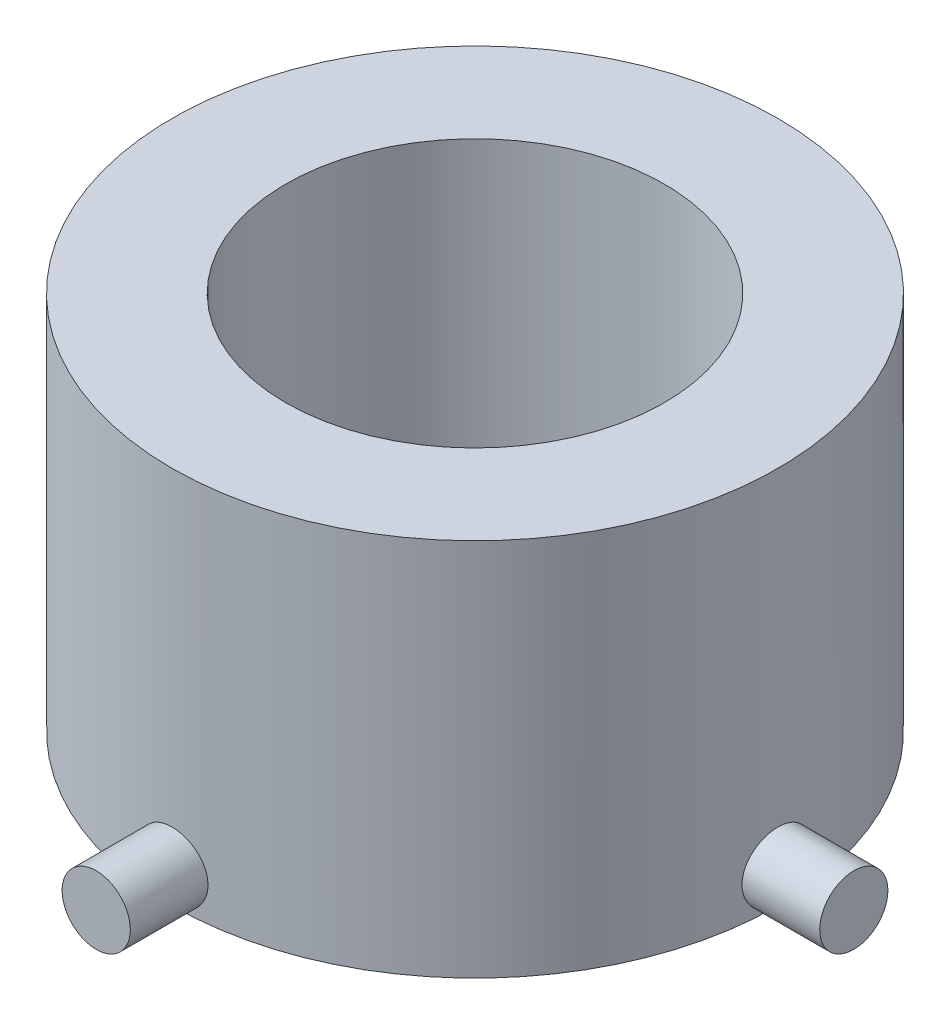
ISO-10303-21;
HEADER;
FILE_DESCRIPTION(('STEP AP214'),'2;1');
FILE_NAME('part.step','',(''),(''),'','','');
FILE_SCHEMA(('AUTOMOTIVE_DESIGN { 1 0 10303 214 1 1 1 1 }'));
ENDSEC;
DATA;
#1=APPLICATION_CONTEXT('core data for automotive mechanical design processes');
#2=APPLICATION_PROTOCOL_DEFINITION('international standard','automotive_design',2000,#1);
#3=PRODUCT_CONTEXT('',#1,'mechanical');
#4=PRODUCT('Part','Part','',(#3));
#5=PRODUCT_RELATED_PRODUCT_CATEGORY('part','',(#4));
#6=PRODUCT_DEFINITION_FORMATION('','',#4);
#7=PRODUCT_DEFINITION_CONTEXT('part definition',#1,'design');
#8=PRODUCT_DEFINITION('design','',#6,#7);
#9=PRODUCT_DEFINITION_SHAPE('','',#8);
#10=(LENGTH_UNIT() NAMED_UNIT(*) SI_UNIT(.MILLI.,.METRE.));
#11=(NAMED_UNIT(*) PLANE_ANGLE_UNIT() SI_UNIT($,.RADIAN.));
#12=(NAMED_UNIT(*) SI_UNIT($,.STERADIAN.) SOLID_ANGLE_UNIT());
#13=UNCERTAINTY_MEASURE_WITH_UNIT(LENGTH_MEASURE(1.E-05),#10,'distance_accuracy_value','');
#14=(GEOMETRIC_REPRESENTATION_CONTEXT(3) GLOBAL_UNCERTAINTY_ASSIGNED_CONTEXT((#13)) GLOBAL_UNIT_ASSIGNED_CONTEXT((#10,
#11,#12)) REPRESENTATION_CONTEXT('',''));
#15=CARTESIAN_POINT('',(0.,0.,0.));
#16=DIRECTION('',(0.,0.,1.));
#17=DIRECTION('',(1.,0.,0.));
#18=AXIS2_PLACEMENT_3D('',#15,#16,#17);
#19=CARTESIAN_POINT('',(0.,10.,0.));
#20=DIRECTION('',(0.,-1.,0.));
#21=DIRECTION('',(0.,0.,-1.));
#22=AXIS2_PLACEMENT_3D('',#19,#20,#21);
#23=CYLINDRICAL_SURFACE('',#22,8.);
#24=CARTESIAN_POINT('',(0.,10.,0.));
#25=DIRECTION('',(0.,1.,0.));
#26=DIRECTION('',(0.,0.,1.));
#27=AXIS2_PLACEMENT_3D('',#24,#25,#26);
#28=CIRCLE('',#27,8.);
#29=CARTESIAN_POINT('',(0.,10.,8.));
#30=VERTEX_POINT('',#29);
#31=EDGE_CURVE('E11',#30,#30,#28,.T.);
#32=ORIENTED_EDGE('',*,*,#31,.F.);
#33=EDGE_LOOP('',(#32));
#34=FACE_BOUND('',#33,.T.);
#35=CARTESIAN_POINT('',(0.,0.,0.));
#36=DIRECTION('',(0.,1.,0.));
#37=DIRECTION('',(0.,0.,1.));
#38=AXIS2_PLACEMENT_3D('',#35,#36,#37);
#39=CIRCLE('',#38,8.);
#40=CARTESIAN_POINT('',(8.,0.,0.));
#41=VERTEX_POINT('',#40);
#42=CARTESIAN_POINT('',(0.,0.,-8.));
#43=VERTEX_POINT('',#42);
#44=EDGE_CURVE('E66',#41,#43,#39,.T.);
#45=ORIENTED_EDGE('',*,*,#44,.T.);
#46=CARTESIAN_POINT('',(0.,1.8,-8.));
#47=CARTESIAN_POINT('',(0.0503826136910159,1.79999783666167,-7.99999935667583));
#48=CARTESIAN_POINT('',(0.100797676048761,1.79575506641593,-7.99951900563169));
#49=CARTESIAN_POINT('',(0.200227651927971,1.77889525419564,-7.99764898644928));
#50=CARTESIAN_POINT('',(0.249241001830474,1.76626921368379,-7.99625834123098));
#51=CARTESIAN_POINT('',(0.344413495364871,1.73301720719379,-7.992724563828));
#52=CARTESIAN_POINT('',(0.39057443480303,1.71239633529982,-7.99058191088391));
#53=CARTESIAN_POINT('',(0.478770776756846,1.66375051795627,-7.98578309815841));
#54=CARTESIAN_POINT('',(0.52080694418916,1.63572694886916,-7.98312703385871));
#55=CARTESIAN_POINT('',(0.599759163027169,1.57293611903694,-7.97758509454738));
#56=CARTESIAN_POINT('',(0.636653999636967,1.53814225812755,-7.97469834043005));
#57=CARTESIAN_POINT('',(0.704093719700676,1.46285547422002,-7.96902755899335));
#58=CARTESIAN_POINT('',(0.734638295741055,1.42236227547831,-7.96624353665253));
#59=CARTESIAN_POINT('',(0.788587581186624,1.33669087512577,-7.96108464318745));
#60=CARTESIAN_POINT('',(0.811972747564414,1.29150029308609,-7.95871089954761));
#61=CARTESIAN_POINT('',(0.850814604864699,1.19780241299746,-7.95465261115414));
#62=CARTESIAN_POINT('',(0.866271540834403,1.14929521751154,-7.95296804509962));
#63=CARTESIAN_POINT('',(0.888754466653442,1.05055945551533,-7.9504870418911));
#64=CARTESIAN_POINT('',(0.895815980754457,1.0003390737752,-7.94968686357296));
#65=CARTESIAN_POINT('',(0.901417478304752,0.899420104490834,-7.9490537122992));
#66=CARTESIAN_POINT('',(0.899957741658663,0.848721532708714,-7.94922070757402));
#67=CARTESIAN_POINT('',(0.888587396280167,0.748531476620196,-7.95049961382356));
#68=CARTESIAN_POINT('',(0.878715736408956,0.699035508647745,-7.95160716973679));
#69=CARTESIAN_POINT('',(0.850862447032439,0.602407265581831,-7.95463560821657));
#70=CARTESIAN_POINT('',(0.832880681938104,0.555275030021136,-7.95655650438093));
#71=CARTESIAN_POINT('',(0.789275160832655,0.464590087470622,-7.96100016783785));
#72=CARTESIAN_POINT('',(0.763634292553836,0.421045677450456,-7.96352428030797));
#73=CARTESIAN_POINT('',(0.705450684443826,0.338863302314036,-7.96888888695146));
#74=CARTESIAN_POINT('',(0.672907688777369,0.300225519152429,-7.97172939285047));
#75=CARTESIAN_POINT('',(0.601626858049831,0.22872697316883,-7.97742612381408));
#76=CARTESIAN_POINT('',(0.562855416352851,0.195899705274758,-7.98028234800384));
#77=CARTESIAN_POINT('',(0.480334500902807,0.137214206258819,-7.98567377111523));
#78=CARTESIAN_POINT('',(0.436585019067056,0.111355986452604,-7.98820896951562));
#79=CARTESIAN_POINT('',(0.345325463401672,0.0673433019288027,-7.99267385954991));
#80=CARTESIAN_POINT('',(0.297814471656244,0.0491907245258462,-7.99460340281281));
#81=CARTESIAN_POINT('',(0.2003923322842,0.0211301201032916,-7.9976381530476));
#82=CARTESIAN_POINT('',(0.150481275650925,0.0112217807812649,-7.99874339124506));
#83=CARTESIAN_POINT('',(0.0499656488345993,-2.61595150837915E-05,-8.00000096917559));
#84=CARTESIAN_POINT('',(-0.000633691758848356,-0.00141194308446338,-8.0001584446093));
#85=CARTESIAN_POINT('',(-0.101343885955021,0.0043029943431661,-7.9995165700168));
#86=CARTESIAN_POINT('',(-0.151454747931611,0.011403569601852,-7.99871723642211));
#87=CARTESIAN_POINT('',(-0.249630819873087,0.0338513252142426,-7.99625479781143));
#88=CARTESIAN_POINT('',(-0.297701079176388,0.0491766940199424,-7.99459397778237));
#89=CARTESIAN_POINT('',(-0.390588839674971,0.0876164674846513,-7.99059469762123));
#90=CARTESIAN_POINT('',(-0.435406249852571,0.110731089992037,-7.98825621853676));
#91=CARTESIAN_POINT('',(-0.520723715656912,0.16420644114032,-7.98314996699525));
#92=CARTESIAN_POINT('',(-0.56120478415625,0.194597291309231,-7.98038042720216));
#93=CARTESIAN_POINT('',(-0.636507797624133,0.261719497716278,-7.97472798900666));
#94=CARTESIAN_POINT('',(-0.671329561809106,0.298451056427833,-7.97184508698661));
#95=CARTESIAN_POINT('',(-0.734487518972592,0.377414437632253,-7.96627520316107));
#96=CARTESIAN_POINT('',(-0.762793256705773,0.419670696692697,-7.96358917982577));
#97=CARTESIAN_POINT('',(-0.811905816075098,0.508364378446475,-7.95873234792182));
#98=CARTESIAN_POINT('',(-0.832712763349627,0.554801731071439,-7.95656153072137));
#99=CARTESIAN_POINT('',(-0.866186913199873,0.650437895645089,-7.95298717065982));
#100=CARTESIAN_POINT('',(-0.878871786408993,0.699630457764009,-7.9515819631155));
#101=CARTESIAN_POINT('',(-0.895798852712383,0.79946403770662,-7.94969295833676));
#102=CARTESIAN_POINT('',(-0.900041358520799,0.850105001809495,-7.94920912697363));
#103=CARTESIAN_POINT('',(-0.899958263371091,0.951095056004341,-7.94921851110784));
#104=CARTESIAN_POINT('',(-0.895680503142055,1.00144419273643,-7.94970627118508));
#105=CARTESIAN_POINT('',(-0.878779087342015,1.10070338997679,-7.95159220302208));
#106=CARTESIAN_POINT('',(-0.866155426023483,1.14961344949399,-7.95299037540882));
#107=CARTESIAN_POINT('',(-0.832934599696574,1.24460291225261,-7.95653799866446));
#108=CARTESIAN_POINT('',(-0.812339272215467,1.29068296499708,-7.95868727638702));
#109=CARTESIAN_POINT('',(-0.763764520766244,1.3787403115201,-7.96349526362828));
#110=CARTESIAN_POINT('',(-0.735785074379504,1.42071759284185,-7.96615397469366));
#111=CARTESIAN_POINT('',(-0.673057524875456,1.49962280395266,-7.97169915956723));
#112=CARTESIAN_POINT('',(-0.638273735860449,1.53652228485187,-7.97458678425881));
#113=CARTESIAN_POINT('',(-0.562997872511411,1.60398005490888,-7.98025406488521));
#114=CARTESIAN_POINT('',(-0.522504443587427,1.63453683502031,-7.98303369499854));
#115=CARTESIAN_POINT('',(-0.436817098618435,1.68852002835685,-7.98818110500421));
#116=CARTESIAN_POINT('',(-0.391608943714962,1.71192395084537,-7.99054757599985));
#117=CARTESIAN_POINT('',(-0.297904797132186,1.75077590493593,-7.99458835779331));
#118=CARTESIAN_POINT('',(-0.249412517038008,1.76623275363604,-7.9962634352677));
#119=CARTESIAN_POINT('',(-0.167213786371124,1.78497012295515,-7.99831983571815));
#120=CARTESIAN_POINT('',(-0.134029615664224,1.7905984391798,-7.9989468975849));
#121=CARTESIAN_POINT('',(-0.0672351126831655,1.7981140891834,-7.99978719324761));
#122=CARTESIAN_POINT('',(-0.0336247827823798,1.80000144378737,-8.00000042934723));
#123=CARTESIAN_POINT('',(0.,1.8,-8.));
#124=B_SPLINE_CURVE_WITH_KNOTS('',3,(#46,#47,#48,#49,#50,#51,#52,#53,#54,#55,#56,#57,#58,#59,
#60,#61,#62,#63,#64,#65,#66,#67,#68,#69,#70,#71,#72,#73,#74,#75,#76,#77,#78,#79,#80,#81,#82,#83,
#84,#85,#86,#87,#88,#89,#90,#91,#92,#93,#94,#95,#96,#97,#98,#99,#100,#101,#102,#103,#104,#105,
#106,#107,#108,#109,#110,#111,#112,#113,#114,#115,#116,#117,#118,#119,#120,#121,#122,#123),
.UNSPECIFIED.,.T.,.F.,(4,2,2,2,2,2,2,2,2,2,2,2,2,2,2,2,2,2,2,2,2,2,2,2,2,2,2,2,2,2,2,2,2,2,2,2,
2,2,4),(0.,0.15102503946976,0.302212450684821,0.453303687385578,0.604366851869748,
0.756035978526991,0.907712445716277,1.05979932632875,1.21188150592852,1.36331785077422,
1.51474922129198,1.66548322100749,1.81621974086717,1.96729559374784,2.11837704740719,
2.27030290105026,2.42222900137409,2.5741922909584,2.72614982371414,2.87728318803154,
3.02841395693587,3.17914590439343,3.32988206784354,3.48125336725002,3.63262950118498,
3.78469940262018,3.93676675608377,4.08850213279841,4.24023188897087,4.3911120942693,
4.54199240347373,4.69283795435707,4.84368396322174,4.99534339827682,5.14703887467574,
5.29920653321029,5.45120499887878,5.5519979519252,5.65279034388037),.UNSPECIFIED.);
#125=EDGE_CURVE('E254',#43,#43,#124,.T.);
#126=ORIENTED_EDGE('',*,*,#125,.F.);
#127=CARTESIAN_POINT('',(-8.,0.,0.));
#128=VERTEX_POINT('',#127);
#129=EDGE_CURVE('E81',#43,#128,#39,.T.);
#130=ORIENTED_EDGE('',*,*,#129,.T.);
#131=CARTESIAN_POINT('',(-7.94921379760288,0.9,0.900000000000028));
#132=CARTESIAN_POINT('',(-7.94921445627188,0.950381476218752,0.899997835652087));
#133=CARTESIAN_POINT('',(-7.94969793486106,1.00079540456717,0.895755250509643));
#134=CARTESIAN_POINT('',(-7.95157912407458,1.10022302438545,0.878896240339585));
#135=CARTESIAN_POINT('',(-7.95297781754362,1.14923515134327,0.866270812804666));
#136=CARTESIAN_POINT('',(-7.95652904780858,1.24440505855777,0.83302059935041));
#137=CARTESIAN_POINT('',(-7.9586811017197,1.29056464497485,0.812400936623751));
#138=CARTESIAN_POINT('',(-7.96349598282749,1.3787587184441,0.763757967073801));
#139=CARTESIAN_POINT('',(-7.96615871524838,1.42079396873873,0.735736033659296));
#140=CARTESIAN_POINT('',(-7.97170853548647,1.49974721740041,0.672946858539004));
#141=CARTESIAN_POINT('',(-7.97459649159433,1.53664371184783,0.638152651014098));
#142=CARTESIAN_POINT('',(-7.98026351593814,1.60408663322698,0.562864477010416));
#143=CARTESIAN_POINT('',(-7.98304257898486,1.63463275783276,0.522370239320649));
#144=CARTESIAN_POINT('',(-7.98818743808495,1.68858366720119,0.436697922910679));
#145=CARTESIAN_POINT('',(-7.99055211238391,1.7119691920802,0.391507642461032));
#146=CARTESIAN_POINT('',(-7.99459226020817,1.75081179528787,0.297810417696474));
#147=CARTESIAN_POINT('',(-7.99626775466908,1.76626911445945,0.249303574182802));
#148=CARTESIAN_POINT('',(-7.99873465384886,1.78875283424111,0.150568913181061));
#149=CARTESIAN_POINT('',(-7.99952978650905,1.79581479491486,0.100349288006981));
#150=CARTESIAN_POINT('',(-8.00015907715855,1.80141744776494,-0.000568198205006565));
#151=CARTESIAN_POINT('',(-7.99999326616292,1.79995841496168,-0.0512660437553234));
#152=CARTESIAN_POINT('',(-7.99872238608439,1.78858918844781,-0.151459191749566));
#153=CARTESIAN_POINT('',(-7.99762156707313,1.77871723492744,-0.200958894889973));
#154=CARTESIAN_POINT('',(-7.99460918902091,1.75086206531074,-0.297594456509434));
#155=CARTESIAN_POINT('',(-7.99269761709508,1.73287872030411,-0.344730277407257));
#156=CARTESIAN_POINT('',(-7.98827125886936,1.68926991864439,-0.435419583674442));
#157=CARTESIAN_POINT('',(-7.98575515321065,1.66362771681398,-0.478964949961027));
#158=CARTESIAN_POINT('',(-7.98040166841159,1.60544125753926,-0.561148672970391));
#159=CARTESIAN_POINT('',(-7.97756427733569,1.57289674363901,-0.599786847280762));
#160=CARTESIAN_POINT('',(-7.97186767955181,1.50161483040945,-0.671283695236465));
#161=CARTESIAN_POINT('',(-7.96900843904542,1.46284413582633,-0.704109180000878));
#162=CARTESIAN_POINT('',(-7.96360599122408,1.38032535249734,-0.762791436479499));
#163=CARTESIAN_POINT('',(-7.96106278459145,1.33657725300584,-0.788648193148635));
#164=CARTESIAN_POINT('',(-7.95658026702254,1.24531808346204,-0.83265982291881));
#165=CARTESIAN_POINT('',(-7.95464113938273,1.19780587673647,-0.850812358922546));
#166=CARTESIAN_POINT('',(-7.95159003782401,1.10038109471719,-0.878872508760402));
#167=CARTESIAN_POINT('',(-7.9504780318275,1.05046861259137,-0.888780442340082));
#168=CARTESIAN_POINT('',(-7.94921279731443,0.949952304277581,-0.90002685087002));
#169=CARTESIAN_POINT('',(-7.9490543594841,0.899353750649538,-0.901411887082231));
#170=CARTESIAN_POINT('',(-7.94970044071154,0.798645309494363,-0.895695735813714));
#171=CARTESIAN_POINT('',(-7.95050494322528,0.748535413586646,-0.888594694129986));
#172=CARTESIAN_POINT('',(-7.95298151348464,0.650364240916269,-0.866147033424266));
#173=CARTESIAN_POINT('',(-7.95465123807096,0.602297808649489,-0.850822680472314));
#174=CARTESIAN_POINT('',(-7.95866821951216,0.509417253264709,-0.812386219219717));
#175=CARTESIAN_POINT('',(-7.96101549584259,0.464603223680054,-0.789273887058351));
#176=CARTESIAN_POINT('',(-7.96613565433273,0.379288091476178,-0.735801923972631));
#177=CARTESIAN_POINT('',(-7.96891032129472,0.338806341017917,-0.705411590072087));
#178=CARTESIAN_POINT('',(-7.9745669030378,0.263501711402116,-0.638290013228046));
#179=CARTESIAN_POINT('',(-7.97744882118422,0.228679009998787,-0.601558571181148));
#180=CARTESIAN_POINT('',(-7.98301104787815,0.165518984407508,-0.522594787215012));
#181=CARTESIAN_POINT('',(-7.98569037105894,0.137212139731649,-0.480337986734692));
#182=CARTESIAN_POINT('',(-7.99053099991163,0.0880976388834588,-0.391642922849477));
#183=CARTESIAN_POINT('',(-7.99269231429187,0.0672898566400656,-0.34520472975679));
#184=CARTESIAN_POINT('',(-7.99624899393949,0.0338151638995223,-0.249569060748985));
#185=CARTESIAN_POINT('',(-7.99764605481408,0.021130220943943,-0.200377962255195));
#186=CARTESIAN_POINT('',(-7.99952381622454,0.00420251935509522,-0.100547472629097));
#187=CARTESIAN_POINT('',(-8.00000454985111,-4.05441343282775E-05,-0.0499081338631487));
#188=CARTESIAN_POINT('',(-7.99999540936068,4.09061387288153E-05,0.0510828436913645));
#189=CARTESIAN_POINT('',(-7.99951087834459,0.00431825621283794,0.101434527584496));
#190=CARTESIAN_POINT('',(-7.99763622288547,0.0212197469313892,0.200698922590991));
#191=CARTESIAN_POINT('',(-7.99624609830419,0.0338438888499703,0.249611633484694));
#192=CARTESIAN_POINT('',(-7.99271587044203,0.0670666965317806,0.344606475628864));
#193=CARTESIAN_POINT('',(-7.9905759368272,0.087663558345962,0.390689244465767));
#194=CARTESIAN_POINT('',(-7.98578387992635,0.136242220728282,0.478751384194778));
#195=CARTESIAN_POINT('',(-7.9831317552961,0.164224040678069,0.520730744317192));
#196=CARTESIAN_POINT('',(-7.97759437756255,0.226954222256357,0.599635885472545));
#197=CARTESIAN_POINT('',(-7.97470796131863,0.261737725495706,0.636533648131449));
#198=CARTESIAN_POINT('',(-7.96903694021893,0.337012307364725,0.703988084789431));
#199=CARTESIAN_POINT('',(-7.96625235979523,0.377504744493446,0.734543245210562));
#200=CARTESIAN_POINT('',(-7.96109092610868,0.463191260052284,0.788524670357459));
#201=CARTESIAN_POINT('',(-7.95871538574438,0.508399756569003,0.811928159901867));
#202=CARTESIAN_POINT('',(-7.95465648241106,0.602104623219119,0.850779210309441));
#203=CARTESIAN_POINT('',(-7.95297235227779,0.650597279359336,0.866235593833719));
#204=CARTESIAN_POINT('',(-7.95090425020267,0.732794768892391,0.88497166972256));
#205=CARTESIAN_POINT('',(-7.95027340280531,0.765977231197086,0.890599403733716));
#206=CARTESIAN_POINT('',(-7.94942795790278,0.832768312751693,0.89811428043151));
#207=CARTESIAN_POINT('',(-7.94921335802714,0.866376929573608,0.900001444420253));
#208=CARTESIAN_POINT('',(-7.94921379760288,0.9,0.900000000000028));
#209=B_SPLINE_CURVE_WITH_KNOTS('',3,(#131,#132,#133,#134,#135,#136,#137,#138,#139,#140,#141,
#142,#143,#144,#145,#146,#147,#148,#149,#150,#151,#152,#153,#154,#155,#156,#157,#158,#159,#160,
#161,#162,#163,#164,#165,#166,#167,#168,#169,#170,#171,#172,#173,#174,#175,#176,#177,#178,#179,
#180,#181,#182,#183,#184,#185,#186,#187,#188,#189,#190,#191,#192,#193,#194,#195,#196,#197,#198,
#199,#200,#201,#202,#203,#204,#205,#206,#207,#208),.UNSPECIFIED.,.T.,.F.,(4,2,2,2,2,2,2,2,2,2,2,
2,2,2,2,2,2,2,2,2,2,2,2,2,2,2,2,2,2,2,2,2,2,2,2,2,2,2,4),(0.,0.151021622555325,
0.302205693237751,0.45329303569084,0.604352365237603,0.756025963768159,0.907706781464112,
1.05979206252322,1.21187272326427,1.36330689721419,1.51473618355847,1.66548081033327,
1.81622783290165,1.96730688901697,2.11839155947006,2.27031286368641,2.42223449588926,
2.57420218106928,2.72616397230135,2.87729484185219,3.02842311490194,3.17914423109056,
3.32986968003555,3.48124254143718,3.63262015663488,3.78469210530163,3.93676149727988,
4.08849211860281,4.24021726047609,4.39110488046043,4.54199252347779,4.69284604581036,
4.84369996405837,4.9953549225054,5.14704602989794,5.29921529528766,5.45121525974133,
5.55200308792678,5.65279034213581),.UNSPECIFIED.);
#210=EDGE_CURVE('E261',#128,#128,#209,.T.);
#211=ORIENTED_EDGE('',*,*,#210,.F.);
#212=CARTESIAN_POINT('',(0.,0.,8.));
#213=VERTEX_POINT('',#212);
#214=EDGE_CURVE('E59',#128,#213,#39,.T.);
#215=ORIENTED_EDGE('',*,*,#214,.T.);
#216=CARTESIAN_POINT('',(0.,0.,8.));
#217=CARTESIAN_POINT('',(0.0503826136910159,2.16333832788108E-06,7.99999935667583));
#218=CARTESIAN_POINT('',(0.100797676048761,0.00424493358406595,7.99951900563169));
#219=CARTESIAN_POINT('',(0.200227651927971,0.0211047458043563,7.99764898644928));
#220=CARTESIAN_POINT('',(0.249241001830474,0.0337307863162147,7.99625834123098));
#221=CARTESIAN_POINT('',(0.344413495364871,0.0669827928062101,7.992724563828));
#222=CARTESIAN_POINT('',(0.39057443480303,0.0876036647001765,7.99058191088391));
#223=CARTESIAN_POINT('',(0.478770776756846,0.136249482043732,7.98578309815841));
#224=CARTESIAN_POINT('',(0.520806944189159,0.164273051130842,7.98312703385871));
#225=CARTESIAN_POINT('',(0.599759163027169,0.227063880963064,7.97758509454738));
#226=CARTESIAN_POINT('',(0.636653999636967,0.261857741872453,7.97469834043005));
#227=CARTESIAN_POINT('',(0.704093719700676,0.337144525779978,7.96902755899335));
#228=CARTESIAN_POINT('',(0.734638295741055,0.377637724521686,7.96624353665253));
#229=CARTESIAN_POINT('',(0.788587581186624,0.463309124874226,7.96108464318745));
#230=CARTESIAN_POINT('',(0.811972747564414,0.508499706913911,7.95871089954761));
#231=CARTESIAN_POINT('',(0.850814604864698,0.602197587002541,7.95465261115414));
#232=CARTESIAN_POINT('',(0.866271540834403,0.65070478248846,7.95296804509962));
#233=CARTESIAN_POINT('',(0.888754466653442,0.749440544484671,7.9504870418911));
#234=CARTESIAN_POINT('',(0.895815980754457,0.799660926224797,7.94968686357296));
#235=CARTESIAN_POINT('',(0.901417478304752,0.900579895509165,7.9490537122992));
#236=CARTESIAN_POINT('',(0.899957741658663,0.951278467291286,7.94922070757402));
#237=CARTESIAN_POINT('',(0.888587396280167,1.0514685233798,7.95049961382356));
#238=CARTESIAN_POINT('',(0.878715736408956,1.10096449135225,7.95160716973679));
#239=CARTESIAN_POINT('',(0.850862447032439,1.19759273441817,7.95463560821657));
#240=CARTESIAN_POINT('',(0.832880681938104,1.24472496997886,7.95655650438093));
#241=CARTESIAN_POINT('',(0.789275160832655,1.33540991252938,7.96100016783785));
#242=CARTESIAN_POINT('',(0.763634292553836,1.37895432254954,7.96352428030797));
#243=CARTESIAN_POINT('',(0.705450684443826,1.46113669768596,7.96888888695146));
#244=CARTESIAN_POINT('',(0.672907688777369,1.49977448084757,7.97172939285047));
#245=CARTESIAN_POINT('',(0.601626858049831,1.57127302683117,7.97742612381408));
#246=CARTESIAN_POINT('',(0.562855416352851,1.60410029472524,7.98028234800384));
#247=CARTESIAN_POINT('',(0.480334500902807,1.66278579374118,7.98567377111523));
#248=CARTESIAN_POINT('',(0.436585019067056,1.6886440135474,7.98820896951562));
#249=CARTESIAN_POINT('',(0.345325463401672,1.7326566980712,7.99267385954991));
#250=CARTESIAN_POINT('',(0.297814471656244,1.75080927547415,7.99460340281281));
#251=CARTESIAN_POINT('',(0.2003923322842,1.77886987989671,7.9976381530476));
#252=CARTESIAN_POINT('',(0.150481275650925,1.78877821921874,7.99874339124506));
#253=CARTESIAN_POINT('',(0.0499656488345992,1.80002615951508,8.00000096917559));
#254=CARTESIAN_POINT('',(-0.000633691758848431,1.80141194308446,8.0001584446093));
#255=CARTESIAN_POINT('',(-0.101343885955022,1.79569700565683,7.9995165700168));
#256=CARTESIAN_POINT('',(-0.151454747931611,1.78859643039815,7.99871723642211));
#257=CARTESIAN_POINT('',(-0.249630819873087,1.76614867478576,7.99625479781143));
#258=CARTESIAN_POINT('',(-0.297701079176388,1.75082330598006,7.99459397778237));
#259=CARTESIAN_POINT('',(-0.390588839674971,1.71238353251535,7.99059469762123));
#260=CARTESIAN_POINT('',(-0.435406249852571,1.68926891000796,7.98825621853676));
#261=CARTESIAN_POINT('',(-0.520723715656912,1.63579355885968,7.98314996699525));
#262=CARTESIAN_POINT('',(-0.56120478415625,1.60540270869077,7.98038042720216));
#263=CARTESIAN_POINT('',(-0.636507797624133,1.53828050228372,7.97472798900666));
#264=CARTESIAN_POINT('',(-0.671329561809106,1.50154894357217,7.97184508698661));
#265=CARTESIAN_POINT('',(-0.734487518972592,1.42258556236775,7.96627520316107));
#266=CARTESIAN_POINT('',(-0.762793256705773,1.3803293033073,7.96358917982577));
#267=CARTESIAN_POINT('',(-0.811905816075098,1.29163562155352,7.95873234792182));
#268=CARTESIAN_POINT('',(-0.832712763349627,1.24519826892856,7.95656153072137));
#269=CARTESIAN_POINT('',(-0.866186913199873,1.14956210435491,7.95298717065982));
#270=CARTESIAN_POINT('',(-0.878871786408993,1.10036954223599,7.9515819631155));
#271=CARTESIAN_POINT('',(-0.895798852712383,1.00053596229338,7.94969295833676));
#272=CARTESIAN_POINT('',(-0.900041358520799,0.949894998190505,7.94920912697363));
#273=CARTESIAN_POINT('',(-0.899958263371091,0.84890494399566,7.94921851110784));
#274=CARTESIAN_POINT('',(-0.895680503142055,0.798555807263574,7.94970627118508));
#275=CARTESIAN_POINT('',(-0.878779087342016,0.699296610023215,7.95159220302208));
#276=CARTESIAN_POINT('',(-0.866155426023483,0.650386550506007,7.95299037540882));
#277=CARTESIAN_POINT('',(-0.832934599696574,0.555397087747391,7.95653799866446));
#278=CARTESIAN_POINT('',(-0.812339272215467,0.509317035002919,7.95868727638702));
#279=CARTESIAN_POINT('',(-0.763764520766244,0.421259688479905,7.96349526362828));
#280=CARTESIAN_POINT('',(-0.735785074379504,0.379282407158151,7.96615397469366));
#281=CARTESIAN_POINT('',(-0.673057524875456,0.300377196047343,7.97169915956723));
#282=CARTESIAN_POINT('',(-0.638273735860449,0.263477715148127,7.97458678425881));
#283=CARTESIAN_POINT('',(-0.562997872511411,0.196019945091116,7.98025406488521));
#284=CARTESIAN_POINT('',(-0.522504443587427,0.16546316497969,7.98303369499854));
#285=CARTESIAN_POINT('',(-0.436817098618435,0.11147997164315,7.98818110500421));
#286=CARTESIAN_POINT('',(-0.391608943714962,0.0880760491546327,7.99054757599985));
#287=CARTESIAN_POINT('',(-0.297904797132186,0.0492240950640666,7.99458835779331));
#288=CARTESIAN_POINT('',(-0.249412517038008,0.0337672463639592,7.9962634352677));
#289=CARTESIAN_POINT('',(-0.167213786371124,0.0150298770448495,7.99831983571815));
#290=CARTESIAN_POINT('',(-0.134029615664224,0.00940156082020277,7.9989468975849));
#291=CARTESIAN_POINT('',(-0.0672351126831655,0.00188591081660079,7.99978719324761));
#292=CARTESIAN_POINT('',(-0.0336247827823798,-1.44378737089555E-06,8.00000042934723));
#293=CARTESIAN_POINT('',(0.,0.,8.));
#294=B_SPLINE_CURVE_WITH_KNOTS('',3,(#216,#217,#218,#219,#220,#221,#222,#223,#224,#225,#226,
#227,#228,#229,#230,#231,#232,#233,#234,#235,#236,#237,#238,#239,#240,#241,#242,#243,#244,#245,
#246,#247,#248,#249,#250,#251,#252,#253,#254,#255,#256,#257,#258,#259,#260,#261,#262,#263,#264,
#265,#266,#267,#268,#269,#270,#271,#272,#273,#274,#275,#276,#277,#278,#279,#280,#281,#282,#283,
#284,#285,#286,#287,#288,#289,#290,#291,#292,#293),.UNSPECIFIED.,.T.,.F.,(4,2,2,2,2,2,2,2,2,2,2,
2,2,2,2,2,2,2,2,2,2,2,2,2,2,2,2,2,2,2,2,2,2,2,2,2,2,2,4),(0.,0.15102503946976,0.302212450684821,
0.453303687385578,0.604366851869748,0.756035978526991,0.907712445716276,1.05979932632875,
1.21188150592852,1.36331785077422,1.51474922129198,1.66548322100749,1.81621974086717,
1.96729559374784,2.11837704740719,2.27030290105026,2.42222900137409,2.5741922909584,
2.72614982371414,2.87728318803154,3.02841395693588,3.17914590439343,3.32988206784354,
3.48125336725002,3.63262950118498,3.78469940262018,3.93676675608377,4.08850213279841,
4.24023188897087,4.3911120942693,4.54199240347373,4.69283795435707,4.84368396322174,
4.99534339827682,5.14703887467574,5.29920653321029,5.45120499887878,5.5519979519252,
5.65279034388037),.UNSPECIFIED.);
#295=EDGE_CURVE('E76',#213,#213,#294,.T.);
#296=ORIENTED_EDGE('',*,*,#295,.F.);
#297=EDGE_CURVE('E47',#213,#41,#39,.T.);
#298=ORIENTED_EDGE('',*,*,#297,.T.);
#299=CARTESIAN_POINT('',(7.94921379760288,0.9,0.899999999999972));
#300=CARTESIAN_POINT('',(7.94921445627189,0.849618523781248,0.899997835652032));
#301=CARTESIAN_POINT('',(7.94969793486107,0.799204595432829,0.895755250509588));
#302=CARTESIAN_POINT('',(7.95157912407459,0.699776975614548,0.878896240339529));
#303=CARTESIAN_POINT('',(7.95297781754362,0.650764848656727,0.866270812804611));
#304=CARTESIAN_POINT('',(7.95652904780858,0.555594941442226,0.833020599350355));
#305=CARTESIAN_POINT('',(7.9586811017197,0.509435355025146,0.812400936623695));
#306=CARTESIAN_POINT('',(7.9634959828275,0.421241281555904,0.763757967073745));
#307=CARTESIAN_POINT('',(7.96615871524839,0.37920603126127,0.73573603365924));
#308=CARTESIAN_POINT('',(7.97170853548647,0.300252782599591,0.672946858538948));
#309=CARTESIAN_POINT('',(7.97459649159433,0.263356288152171,0.638152651014042));
#310=CARTESIAN_POINT('',(7.98026351593815,0.195913366773018,0.56286447701036));
#311=CARTESIAN_POINT('',(7.98304257898486,0.165367242167241,0.522370239320593));
#312=CARTESIAN_POINT('',(7.98818743808496,0.111416332798811,0.436697922910623));
#313=CARTESIAN_POINT('',(7.99055211238391,0.0880308079198007,0.391507642460977));
#314=CARTESIAN_POINT('',(7.99459226020817,0.0491882047121273,0.297810417696418));
#315=CARTESIAN_POINT('',(7.99626775466908,0.0337308855405503,0.249303574182746));
#316=CARTESIAN_POINT('',(7.99873465384886,0.0112471657588887,0.150568913181005));
#317=CARTESIAN_POINT('',(7.99952978650905,0.0041852050851442,0.100349288006925));
#318=CARTESIAN_POINT('',(8.00015907715855,-0.00141744776494147,-0.00056819820506253));
#319=CARTESIAN_POINT('',(7.99999326616292,4.15850383246973E-05,-0.0512660437553793));
#320=CARTESIAN_POINT('',(7.99872238608439,0.0114108115521859,-0.151459191749622));
#321=CARTESIAN_POINT('',(7.99762156707313,0.0212827650725609,-0.200958894890029));
#322=CARTESIAN_POINT('',(7.9946091890209,0.0491379346892613,-0.29759445650949));
#323=CARTESIAN_POINT('',(7.99269761709508,0.0671212796958852,-0.344730277407313));
#324=CARTESIAN_POINT('',(7.98827125886936,0.11073008135561,-0.435419583674498));
#325=CARTESIAN_POINT('',(7.98575515321064,0.136372283186021,-0.478964949961083));
#326=CARTESIAN_POINT('',(7.98040166841158,0.194558742460743,-0.561148672970447));
#327=CARTESIAN_POINT('',(7.97756427733568,0.227103256360994,-0.599786847280818));
#328=CARTESIAN_POINT('',(7.9718676795518,0.298385169590553,-0.671283695236521));
#329=CARTESIAN_POINT('',(7.96900843904541,0.337155864173674,-0.704109180000934));
#330=CARTESIAN_POINT('',(7.96360599122408,0.419674647502662,-0.762791436479555));
#331=CARTESIAN_POINT('',(7.96106278459144,0.463422746994163,-0.788648193148691));
#332=CARTESIAN_POINT('',(7.95658026702253,0.554681916537958,-0.832659822918866));
#333=CARTESIAN_POINT('',(7.95464113938273,0.602194123263527,-0.850812358922601));
#334=CARTESIAN_POINT('',(7.951590037824,0.699618905282807,-0.878872508760457));
#335=CARTESIAN_POINT('',(7.95047803182749,0.749531387408629,-0.888780442340137));
#336=CARTESIAN_POINT('',(7.94921279731442,0.850047695722419,-0.900026850870076));
#337=CARTESIAN_POINT('',(7.94905435948409,0.900646249350462,-0.901411887082286));
#338=CARTESIAN_POINT('',(7.94970044071153,1.00135469050564,-0.89569573581377));
#339=CARTESIAN_POINT('',(7.95050494322528,1.05146458641335,-0.888594694130042));
#340=CARTESIAN_POINT('',(7.95298151348463,1.14963575908373,-0.866147033424321));
#341=CARTESIAN_POINT('',(7.95465123807095,1.19770219135051,-0.850822680472369));
#342=CARTESIAN_POINT('',(7.95866821951216,1.29058274673529,-0.812386219219772));
#343=CARTESIAN_POINT('',(7.96101549584258,1.33539677631995,-0.789273887058406));
#344=CARTESIAN_POINT('',(7.96613565433273,1.42071190852382,-0.735801923972686));
#345=CARTESIAN_POINT('',(7.96891032129471,1.46119365898208,-0.705411590072143));
#346=CARTESIAN_POINT('',(7.97456690303779,1.53649828859788,-0.638290013228101));
#347=CARTESIAN_POINT('',(7.97744882118422,1.57132099000121,-0.601558571181203));
#348=CARTESIAN_POINT('',(7.98301104787815,1.63448101559249,-0.522594787215067));
#349=CARTESIAN_POINT('',(7.98569037105894,1.66278786026835,-0.480337986734747));
#350=CARTESIAN_POINT('',(7.99053099991163,1.71190236111654,-0.391642922849532));
#351=CARTESIAN_POINT('',(7.99269231429186,1.73271014335993,-0.345204729756846));
#352=CARTESIAN_POINT('',(7.99624899393949,1.76618483610048,-0.249569060749041));
#353=CARTESIAN_POINT('',(7.99764605481408,1.77886977905606,-0.200377962255251));
#354=CARTESIAN_POINT('',(7.99952381622454,1.7957974806449,-0.100547472629152));
#355=CARTESIAN_POINT('',(8.00000454985111,1.80004054413433,-0.049908133863204));
#356=CARTESIAN_POINT('',(7.99999540936068,1.79995909386127,0.0510828436913094));
#357=CARTESIAN_POINT('',(7.99951087834459,1.79568174378716,0.101434527584441));
#358=CARTESIAN_POINT('',(7.99763622288547,1.77878025306861,0.200698922590936));
#359=CARTESIAN_POINT('',(7.99624609830419,1.76615611115003,0.249611633484639));
#360=CARTESIAN_POINT('',(7.99271587044203,1.73293330346822,0.344606475628809));
#361=CARTESIAN_POINT('',(7.99057593682721,1.71233644165404,0.390689244465711));
#362=CARTESIAN_POINT('',(7.98578387992636,1.66375777927172,0.478751384194723));
#363=CARTESIAN_POINT('',(7.9831317552961,1.63577595932193,0.520730744317137));
#364=CARTESIAN_POINT('',(7.97759437756255,1.57304577774364,0.59963588547249));
#365=CARTESIAN_POINT('',(7.97470796131863,1.53826227450429,0.636533648131394));
#366=CARTESIAN_POINT('',(7.96903694021894,1.46298769263527,0.703988084789376));
#367=CARTESIAN_POINT('',(7.96625235979524,1.42249525550655,0.734543245210506));
#368=CARTESIAN_POINT('',(7.96109092610868,1.33680873994772,0.788524670357403));
#369=CARTESIAN_POINT('',(7.95871538574439,1.291600243431,0.811928159901812));
#370=CARTESIAN_POINT('',(7.95465648241107,1.19789537678088,0.850779210309386));
#371=CARTESIAN_POINT('',(7.95297235227779,1.14940272064066,0.866235593833664));
#372=CARTESIAN_POINT('',(7.95090425020268,1.06720523110761,0.884971669722505));
#373=CARTESIAN_POINT('',(7.95027340280531,1.03402276880291,0.89059940373366));
#374=CARTESIAN_POINT('',(7.94942795790279,0.967231687248307,0.898114280431455));
#375=CARTESIAN_POINT('',(7.94921335802715,0.933623070426392,0.900001444420198));
#376=CARTESIAN_POINT('',(7.94921379760288,0.9,0.899999999999972));
#377=B_SPLINE_CURVE_WITH_KNOTS('',3,(#299,#300,#301,#302,#303,#304,#305,#306,#307,#308,#309,
#310,#311,#312,#313,#314,#315,#316,#317,#318,#319,#320,#321,#322,#323,#324,#325,#326,#327,#328,
#329,#330,#331,#332,#333,#334,#335,#336,#337,#338,#339,#340,#341,#342,#343,#344,#345,#346,#347,
#348,#349,#350,#351,#352,#353,#354,#355,#356,#357,#358,#359,#360,#361,#362,#363,#364,#365,#366,
#367,#368,#369,#370,#371,#372,#373,#374,#375,#376),.UNSPECIFIED.,.T.,.F.,(4,2,2,2,2,2,2,2,2,2,2,
2,2,2,2,2,2,2,2,2,2,2,2,2,2,2,2,2,2,2,2,2,2,2,2,2,2,2,4),(0.,0.151021622555325,
0.302205693237751,0.45329303569084,0.604352365237603,0.75602596376816,0.907706781464112,
1.05979206252322,1.21187272326427,1.36330689721419,1.51473618355847,1.66548081033327,
1.81622783290165,1.96730688901698,2.11839155947006,2.27031286368641,2.42223449588926,
2.57420218106928,2.72616397230135,2.87729484185219,3.02842311490194,3.17914423109056,
3.32986968003555,3.48124254143718,3.63262015663489,3.78469210530163,3.93676149727989,
4.08849211860281,4.24021726047609,4.39110488046043,4.54199252347779,4.69284604581036,
4.84369996405837,4.9953549225054,5.14704602989794,5.29921529528766,5.45121525974133,
5.55200308792678,5.65279034213581),.UNSPECIFIED.);
#378=EDGE_CURVE('E74',#41,#41,#377,.T.);
#379=ORIENTED_EDGE('',*,*,#378,.F.);
#380=EDGE_LOOP('',(#45,#126,#130,#211,#215,#296,#298,#379));
#381=FACE_BOUND('',#380,.T.);
#382=ADVANCED_FACE('F43',(#34,#381),#23,.T.);
#383=CARTESIAN_POINT('',(0.,10.,0.));
#384=DIRECTION('',(0.,-1.,0.));
#385=DIRECTION('',(0.,0.,-1.));
#386=AXIS2_PLACEMENT_3D('',#383,#384,#385);
#387=CYLINDRICAL_SURFACE('',#386,5.);
#388=CARTESIAN_POINT('',(0.,10.,0.));
#389=DIRECTION('',(0.,1.,0.));
#390=DIRECTION('',(0.,0.,1.));
#391=AXIS2_PLACEMENT_3D('',#388,#389,#390);
#392=CIRCLE('',#391,5.);
#393=CARTESIAN_POINT('',(0.,10.,5.));
#394=VERTEX_POINT('',#393);
#395=EDGE_CURVE('E85',#394,#394,#392,.T.);
#396=ORIENTED_EDGE('',*,*,#395,.T.);
#397=EDGE_LOOP('',(#396));
#398=FACE_BOUND('',#397,.T.);
#399=CARTESIAN_POINT('',(0.,0.,0.));
#400=DIRECTION('',(0.,1.,0.));
#401=DIRECTION('',(0.,0.,1.));
#402=AXIS2_PLACEMENT_3D('',#399,#400,#401);
#403=CIRCLE('',#402,5.);
#404=CARTESIAN_POINT('',(0.,0.,5.));
#405=VERTEX_POINT('',#404);
#406=EDGE_CURVE('E88',#405,#405,#403,.T.);
#407=ORIENTED_EDGE('',*,*,#406,.F.);
#408=EDGE_LOOP('',(#407));
#409=FACE_BOUND('',#408,.T.);
#410=ADVANCED_FACE('F112',(#398,#409),#387,.F.);
#411=CARTESIAN_POINT('',(0.,10.,0.));
#412=DIRECTION('',(0.,1.,0.));
#413=DIRECTION('',(0.,0.,1.));
#414=AXIS2_PLACEMENT_3D('',#411,#412,#413);
#415=PLANE('',#414);
#416=ORIENTED_EDGE('',*,*,#31,.T.);
#417=EDGE_LOOP('',(#416));
#418=FACE_BOUND('',#417,.T.);
#419=ORIENTED_EDGE('',*,*,#395,.F.);
#420=EDGE_LOOP('',(#419));
#421=FACE_BOUND('',#420,.T.);
#422=ADVANCED_FACE('F115',(#418,#421),#415,.T.);
#423=CARTESIAN_POINT('',(0.,0.,0.));
#424=DIRECTION('',(0.,1.,0.));
#425=DIRECTION('',(0.,0.,1.));
#426=AXIS2_PLACEMENT_3D('',#423,#424,#425);
#427=PLANE('',#426);
#428=ORIENTED_EDGE('',*,*,#129,.F.);
#429=ORIENTED_EDGE('',*,*,#44,.F.);
#430=ORIENTED_EDGE('',*,*,#297,.F.);
#431=ORIENTED_EDGE('',*,*,#214,.F.);
#432=EDGE_LOOP('',(#428,#429,#430,#431));
#433=FACE_BOUND('',#432,.T.);
#434=ORIENTED_EDGE('',*,*,#406,.T.);
#435=EDGE_LOOP('',(#434));
#436=FACE_BOUND('',#435,.T.);
#437=ADVANCED_FACE('F79',(#433,#436),#427,.F.);
#438=CARTESIAN_POINT('',(0.,0.9,10.));
#439=DIRECTION('',(0.,0.,-1.));
#440=DIRECTION('',(-1.,0.,0.));
#441=AXIS2_PLACEMENT_3D('',#438,#439,#440);
#442=CYLINDRICAL_SURFACE('',#441,0.9);
#443=CARTESIAN_POINT('',(0.,0.9,10.));
#444=DIRECTION('',(0.,0.,1.));
#445=DIRECTION('',(1.,0.,0.));
#446=AXIS2_PLACEMENT_3D('',#443,#444,#445);
#447=CIRCLE('',#446,0.9);
#448=CARTESIAN_POINT('',(0.9,0.9,10.));
#449=VERTEX_POINT('',#448);
#450=EDGE_CURVE('E102',#449,#449,#447,.T.);
#451=ORIENTED_EDGE('',*,*,#450,.F.);
#452=EDGE_LOOP('',(#451));
#453=FACE_BOUND('',#452,.T.);
#454=ORIENTED_EDGE('',*,*,#295,.T.);
#455=EDGE_LOOP('',(#454));
#456=FACE_BOUND('',#455,.T.);
#457=ADVANCED_FACE('F104',(#453,#456),#442,.T.);
#458=CARTESIAN_POINT('',(0.,0.9,10.));
#459=DIRECTION('',(0.,0.,1.));
#460=DIRECTION('',(1.,0.,0.));
#461=AXIS2_PLACEMENT_3D('',#458,#459,#460);
#462=PLANE('',#461);
#463=ORIENTED_EDGE('',*,*,#450,.T.);
#464=EDGE_LOOP('',(#463));
#465=FACE_BOUND('',#464,.T.);
#466=ADVANCED_FACE('F109',(#465),#462,.T.);
#467=CARTESIAN_POINT('',(-10.,0.9,1.04744440165294E-13));
#468=DIRECTION('',(-1.,0.,0.));
#469=DIRECTION('',(0.,0.,1.));
#470=AXIS2_PLACEMENT_3D('',#467,#468,#469);
#471=PLANE('',#470);
#472=CARTESIAN_POINT('',(-10.,0.9,1.04744440165294E-13));
#473=DIRECTION('',(-1.,0.,0.));
#474=DIRECTION('',(0.,0.,1.));
#475=AXIS2_PLACEMENT_3D('',#472,#473,#474);
#476=CIRCLE('',#475,0.9);
#477=CARTESIAN_POINT('',(-9.99999999999999,0.9,0.900000000000105));
#478=VERTEX_POINT('',#477);
#479=EDGE_CURVE('E282',#478,#478,#476,.T.);
#480=ORIENTED_EDGE('',*,*,#479,.T.);
#481=EDGE_LOOP('',(#480));
#482=FACE_BOUND('',#481,.T.);
#483=ADVANCED_FACE('F154',(#482),#471,.T.);
#484=CARTESIAN_POINT('',(10.,0.9,0.));
#485=DIRECTION('',(-1.,0.,0.));
#486=DIRECTION('',(0.,0.,1.));
#487=AXIS2_PLACEMENT_3D('',#484,#485,#486);
#488=CYLINDRICAL_SURFACE('',#487,0.9);
#489=ORIENTED_EDGE('',*,*,#479,.F.);
#490=EDGE_LOOP('',(#489));
#491=FACE_BOUND('',#490,.T.);
#492=ORIENTED_EDGE('',*,*,#210,.T.);
#493=EDGE_LOOP('',(#492));
#494=FACE_BOUND('',#493,.T.);
#495=ADVANCED_FACE('F164',(#491,#494),#488,.T.);
#496=CARTESIAN_POINT('',(10.,0.9,0.));
#497=DIRECTION('',(1.,0.,0.));
#498=DIRECTION('',(0.,0.,-1.));
#499=AXIS2_PLACEMENT_3D('',#496,#497,#498);
#500=PLANE('',#499);
#501=CARTESIAN_POINT('',(10.,0.9,0.));
#502=DIRECTION('',(1.,0.,0.));
#503=DIRECTION('',(0.,0.,-1.));
#504=AXIS2_PLACEMENT_3D('',#501,#502,#503);
#505=CIRCLE('',#504,0.9);
#506=CARTESIAN_POINT('',(10.,0.9,-0.900000000000035));
#507=VERTEX_POINT('',#506);
#508=EDGE_CURVE('E275',#507,#507,#505,.T.);
#509=ORIENTED_EDGE('',*,*,#508,.T.);
#510=EDGE_LOOP('',(#509));
#511=FACE_BOUND('',#510,.T.);
#512=ADVANCED_FACE('F172',(#511),#500,.T.);
#513=ORIENTED_EDGE('',*,*,#508,.F.);
#514=EDGE_LOOP('',(#513));
#515=FACE_BOUND('',#514,.T.);
#516=ORIENTED_EDGE('',*,*,#378,.T.);
#517=EDGE_LOOP('',(#516));
#518=FACE_BOUND('',#517,.T.);
#519=ADVANCED_FACE('F174',(#515,#518),#488,.T.);
#520=CARTESIAN_POINT('',(0.,0.9,-10.));
#521=DIRECTION('',(0.,0.,1.));
#522=DIRECTION('',(1.,0.,0.));
#523=AXIS2_PLACEMENT_3D('',#520,#521,#522);
#524=CYLINDRICAL_SURFACE('',#523,0.9);
#525=CARTESIAN_POINT('',(0.,0.9,-10.));
#526=DIRECTION('',(0.,0.,-1.));
#527=DIRECTION('',(-1.,0.,0.));
#528=AXIS2_PLACEMENT_3D('',#525,#526,#527);
#529=CIRCLE('',#528,0.9);
#530=CARTESIAN_POINT('',(-0.9,0.9,-10.));
#531=VERTEX_POINT('',#530);
#532=EDGE_CURVE('E279',#531,#531,#529,.T.);
#533=ORIENTED_EDGE('',*,*,#532,.F.);
#534=EDGE_LOOP('',(#533));
#535=FACE_BOUND('',#534,.T.);
#536=ORIENTED_EDGE('',*,*,#125,.T.);
#537=EDGE_LOOP('',(#536));
#538=FACE_BOUND('',#537,.T.);
#539=ADVANCED_FACE('F187',(#535,#538),#524,.T.);
#540=CARTESIAN_POINT('',(0.,0.9,-10.));
#541=DIRECTION('',(0.,0.,-1.));
#542=DIRECTION('',(-1.,0.,0.));
#543=AXIS2_PLACEMENT_3D('',#540,#541,#542);
#544=PLANE('',#543);
#545=ORIENTED_EDGE('',*,*,#532,.T.);
#546=EDGE_LOOP('',(#545));
#547=FACE_BOUND('',#546,.T.);
#548=ADVANCED_FACE('F194',(#547),#544,.T.);
#549=CLOSED_SHELL('',(#382,#410,#422,#437,#457,#466,#483,#495,#512,#519,#539,#548));
#550=MANIFOLD_SOLID_BREP('B2',#549);
#551=ADVANCED_BREP_SHAPE_REPRESENTATION('',(#18,#550),#14);
#552=SHAPE_DEFINITION_REPRESENTATION(#9,#551);
ENDSEC;
END-ISO-10303-21;
